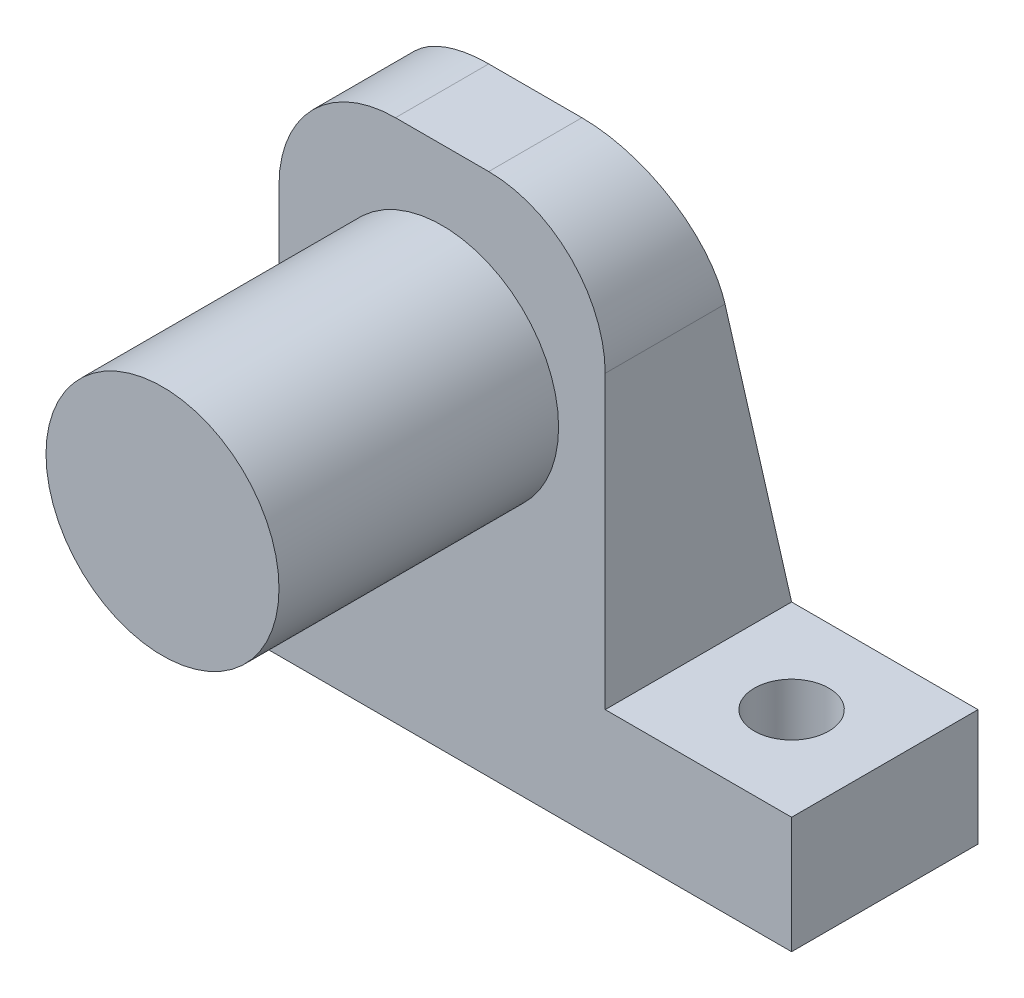
ISO-10303-21;
HEADER;
FILE_DESCRIPTION(('STEP AP214'),'2;1');
FILE_NAME('part.step','',(''),(''),'','','');
FILE_SCHEMA(('AUTOMOTIVE_DESIGN { 1 0 10303 214 1 1 1 1 }'));
ENDSEC;
DATA;
#1=APPLICATION_CONTEXT('core data for automotive mechanical design processes');
#2=APPLICATION_PROTOCOL_DEFINITION('international standard','automotive_design',2000,#1);
#3=PRODUCT_CONTEXT('',#1,'mechanical');
#4=PRODUCT('Part','Part','',(#3));
#5=PRODUCT_RELATED_PRODUCT_CATEGORY('part','',(#4));
#6=PRODUCT_DEFINITION_FORMATION('','',#4);
#7=PRODUCT_DEFINITION_CONTEXT('part definition',#1,'design');
#8=PRODUCT_DEFINITION('design','',#6,#7);
#9=PRODUCT_DEFINITION_SHAPE('','',#8);
#10=(LENGTH_UNIT() NAMED_UNIT(*) SI_UNIT(.MILLI.,.METRE.));
#11=(NAMED_UNIT(*) PLANE_ANGLE_UNIT() SI_UNIT($,.RADIAN.));
#12=(NAMED_UNIT(*) SI_UNIT($,.STERADIAN.) SOLID_ANGLE_UNIT());
#13=UNCERTAINTY_MEASURE_WITH_UNIT(LENGTH_MEASURE(1.E-05),#10,'distance_accuracy_value','');
#14=(GEOMETRIC_REPRESENTATION_CONTEXT(3) GLOBAL_UNCERTAINTY_ASSIGNED_CONTEXT((#13)) GLOBAL_UNIT_ASSIGNED_CONTEXT((#10,
#11,#12)) REPRESENTATION_CONTEXT('',''));
#15=CARTESIAN_POINT('',(0.,0.,0.));
#16=DIRECTION('',(0.,0.,1.));
#17=DIRECTION('',(1.,0.,0.));
#18=AXIS2_PLACEMENT_3D('',#15,#16,#17);
#19=CARTESIAN_POINT('',(7.,5.,8.));
#20=DIRECTION('',(-1.,0.,0.));
#21=DIRECTION('',(0.,0.,1.));
#22=AXIS2_PLACEMENT_3D('',#19,#20,#21);
#23=PLANE('',#22);
#24=DIRECTION('',(0.,-0.974858506571867,-0.222824801502141));
#25=VECTOR('',#24,1.);
#26=CARTESIAN_POINT('',(7.,6.7377812257564,0.397207137315748));
#27=LINE('',#26,#25);
#28=CARTESIAN_POINT('',(7.,17.5,2.85714285714285));
#29=VERTEX_POINT('',#28);
#30=CARTESIAN_POINT('',(7.,5.,0.));
#31=VERTEX_POINT('',#30);
#32=EDGE_CURVE('E48',#29,#31,#27,.T.);
#33=ORIENTED_EDGE('',*,*,#32,.F.);
#34=DIRECTION('',(0.,0.,-1.));
#35=VECTOR('',#34,1.);
#36=CARTESIAN_POINT('',(7.,17.5,8.));
#37=LINE('',#36,#35);
#38=CARTESIAN_POINT('',(7.,17.5,8.));
#39=VERTEX_POINT('',#38);
#40=EDGE_CURVE('E202',#39,#29,#37,.T.);
#41=ORIENTED_EDGE('',*,*,#40,.F.);
#42=DIRECTION('',(0.,1.,0.));
#43=VECTOR('',#42,1.);
#44=CARTESIAN_POINT('',(7.,5.,8.));
#45=LINE('',#44,#43);
#46=CARTESIAN_POINT('',(7.,5.,8.));
#47=VERTEX_POINT('',#46);
#48=EDGE_CURVE('E173',#47,#39,#45,.T.);
#49=ORIENTED_EDGE('',*,*,#48,.F.);
#50=DIRECTION('',(0.,0.,-1.));
#51=VECTOR('',#50,1.);
#52=CARTESIAN_POINT('',(7.,5.,8.));
#53=LINE('',#52,#51);
#54=EDGE_CURVE('E204',#47,#31,#53,.T.);
#55=ORIENTED_EDGE('',*,*,#54,.T.);
#56=EDGE_LOOP('',(#33,#41,#49,#55));
#57=FACE_BOUND('',#56,.T.);
#58=ADVANCED_FACE('F33',(#57),#23,.F.);
#59=CARTESIAN_POINT('',(2.,17.5,8.));
#60=DIRECTION('',(0.,0.,-1.));
#61=DIRECTION('',(-1.,0.,0.));
#62=AXIS2_PLACEMENT_3D('',#59,#60,#61);
#63=CYLINDRICAL_SURFACE('',#62,5.);
#64=CARTESIAN_POINT('',(2.,17.5,2.85714285714286));
#65=DIRECTION('',(0.,0.222824801502141,-0.974858506571867));
#66=DIRECTION('',(0.,-0.974858506571867,-0.222824801502141));
#67=AXIS2_PLACEMENT_3D('',#64,#65,#66);
#68=ELLIPSE('',#67,5.12894944886178,5.);
#69=CARTESIAN_POINT('',(1.99999999999996,22.5,4.));
#70=VERTEX_POINT('',#69);
#71=EDGE_CURVE('E55',#70,#29,#68,.T.);
#72=ORIENTED_EDGE('',*,*,#71,.F.);
#73=DIRECTION('',(0.,0.,-1.));
#74=VECTOR('',#73,1.);
#75=CARTESIAN_POINT('',(1.99999999999996,22.5,8.));
#76=LINE('',#75,#74);
#77=CARTESIAN_POINT('',(1.99999999999996,22.5,8.));
#78=VERTEX_POINT('',#77);
#79=EDGE_CURVE('E200',#78,#70,#76,.T.);
#80=ORIENTED_EDGE('',*,*,#79,.F.);
#81=CARTESIAN_POINT('',(2.,17.5,8.));
#82=DIRECTION('',(0.,0.,1.));
#83=DIRECTION('',(1.,0.,0.));
#84=AXIS2_PLACEMENT_3D('',#81,#82,#83);
#85=CIRCLE('',#84,5.);
#86=EDGE_CURVE('E175',#39,#78,#85,.T.);
#87=ORIENTED_EDGE('',*,*,#86,.F.);
#88=ORIENTED_EDGE('',*,*,#40,.T.);
#89=EDGE_LOOP('',(#72,#80,#87,#88));
#90=FACE_BOUND('',#89,.T.);
#91=ADVANCED_FACE('F234',(#90),#63,.T.);
#92=CARTESIAN_POINT('',(-1.99999999999996,22.5,8.));
#93=DIRECTION('',(0.,-1.,0.));
#94=DIRECTION('',(0.,0.,-1.));
#95=AXIS2_PLACEMENT_3D('',#92,#93,#94);
#96=PLANE('',#95);
#97=DIRECTION('',(1.,0.,0.));
#98=VECTOR('',#97,1.);
#99=CARTESIAN_POINT('',(-105.625,22.5,4.));
#100=LINE('',#99,#98);
#101=CARTESIAN_POINT('',(-1.99999999999996,22.5,4.));
#102=VERTEX_POINT('',#101);
#103=EDGE_CURVE('E143',#102,#70,#100,.T.);
#104=ORIENTED_EDGE('',*,*,#103,.F.);
#105=DIRECTION('',(0.,0.,-1.));
#106=VECTOR('',#105,1.);
#107=CARTESIAN_POINT('',(-1.99999999999996,22.5,8.));
#108=LINE('',#107,#106);
#109=CARTESIAN_POINT('',(-1.99999999999996,22.5,8.));
#110=VERTEX_POINT('',#109);
#111=EDGE_CURVE('E197',#110,#102,#108,.T.);
#112=ORIENTED_EDGE('',*,*,#111,.F.);
#113=DIRECTION('',(-1.,0.,0.));
#114=VECTOR('',#113,1.);
#115=CARTESIAN_POINT('',(-1.99999999999996,22.5,8.));
#116=LINE('',#115,#114);
#117=EDGE_CURVE('E177',#78,#110,#116,.T.);
#118=ORIENTED_EDGE('',*,*,#117,.F.);
#119=ORIENTED_EDGE('',*,*,#79,.T.);
#120=EDGE_LOOP('',(#104,#112,#118,#119));
#121=FACE_BOUND('',#120,.T.);
#122=ADVANCED_FACE('F239',(#121),#96,.F.);
#123=CARTESIAN_POINT('',(-2.,17.5,8.));
#124=DIRECTION('',(0.,0.,-1.));
#125=DIRECTION('',(-1.,0.,0.));
#126=AXIS2_PLACEMENT_3D('',#123,#124,#125);
#127=CYLINDRICAL_SURFACE('',#126,5.);
#128=CARTESIAN_POINT('',(-2.,17.5,2.85714285714286));
#129=DIRECTION('',(0.,0.222824801502141,-0.974858506571867));
#130=DIRECTION('',(0.,-0.974858506571867,-0.222824801502141));
#131=AXIS2_PLACEMENT_3D('',#128,#129,#130);
#132=ELLIPSE('',#131,5.12894944886178,5.);
#133=CARTESIAN_POINT('',(-7.,17.5,2.85714285714285));
#134=VERTEX_POINT('',#133);
#135=EDGE_CURVE('E142',#134,#102,#132,.T.);
#136=ORIENTED_EDGE('',*,*,#135,.F.);
#137=DIRECTION('',(0.,0.,-1.));
#138=VECTOR('',#137,1.);
#139=CARTESIAN_POINT('',(-7.,17.5,8.));
#140=LINE('',#139,#138);
#141=CARTESIAN_POINT('',(-7.,17.5,8.));
#142=VERTEX_POINT('',#141);
#143=EDGE_CURVE('E132',#142,#134,#140,.T.);
#144=ORIENTED_EDGE('',*,*,#143,.F.);
#145=CARTESIAN_POINT('',(-2.,17.5,8.));
#146=DIRECTION('',(0.,0.,1.));
#147=DIRECTION('',(1.,0.,0.));
#148=AXIS2_PLACEMENT_3D('',#145,#146,#147);
#149=CIRCLE('',#148,5.);
#150=EDGE_CURVE('E179',#110,#142,#149,.T.);
#151=ORIENTED_EDGE('',*,*,#150,.F.);
#152=ORIENTED_EDGE('',*,*,#111,.T.);
#153=EDGE_LOOP('',(#136,#144,#151,#152));
#154=FACE_BOUND('',#153,.T.);
#155=ADVANCED_FACE('F273',(#154),#127,.T.);
#156=CARTESIAN_POINT('',(-7.,5.,8.));
#157=DIRECTION('',(1.,0.,0.));
#158=DIRECTION('',(0.,0.,-1.));
#159=AXIS2_PLACEMENT_3D('',#156,#157,#158);
#160=PLANE('',#159);
#161=DIRECTION('',(0.,0.974858506571867,0.222824801502141));
#162=VECTOR('',#161,1.);
#163=CARTESIAN_POINT('',(-7.,6.7377812257564,0.397207137315748));
#164=LINE('',#163,#162);
#165=CARTESIAN_POINT('',(-6.99999999999999,5.,0.));
#166=VERTEX_POINT('',#165);
#167=EDGE_CURVE('E137',#166,#134,#164,.T.);
#168=ORIENTED_EDGE('',*,*,#167,.F.);
#169=DIRECTION('',(0.,0.,-1.));
#170=VECTOR('',#169,1.);
#171=CARTESIAN_POINT('',(-7.,5.,8.));
#172=LINE('',#171,#170);
#173=CARTESIAN_POINT('',(-7.,5.,8.));
#174=VERTEX_POINT('',#173);
#175=EDGE_CURVE('E126',#174,#166,#172,.T.);
#176=ORIENTED_EDGE('',*,*,#175,.F.);
#177=DIRECTION('',(0.,-1.,0.));
#178=VECTOR('',#177,1.);
#179=CARTESIAN_POINT('',(-7.,5.,8.));
#180=LINE('',#179,#178);
#181=EDGE_CURVE('E181',#142,#174,#180,.T.);
#182=ORIENTED_EDGE('',*,*,#181,.F.);
#183=ORIENTED_EDGE('',*,*,#143,.T.);
#184=EDGE_LOOP('',(#168,#176,#182,#183));
#185=FACE_BOUND('',#184,.T.);
#186=ADVANCED_FACE('F138',(#185),#160,.F.);
#187=CARTESIAN_POINT('',(2.,17.5,0.));
#188=DIRECTION('',(0.,0.,1.));
#189=DIRECTION('',(1.,0.,0.));
#190=AXIS2_PLACEMENT_3D('',#187,#188,#189);
#191=PLANE('',#190);
#192=DIRECTION('',(-1.,0.,0.));
#193=VECTOR('',#192,1.);
#194=CARTESIAN_POINT('',(2.,5.,0.));
#195=LINE('',#194,#193);
#196=EDGE_CURVE('E11',#31,#166,#195,.T.);
#197=ORIENTED_EDGE('',*,*,#196,.F.);
#198=DIRECTION('',(-1.,0.,0.));
#199=VECTOR('',#198,1.);
#200=CARTESIAN_POINT('',(15.,5.,0.));
#201=LINE('',#200,#199);
#202=CARTESIAN_POINT('',(15.,5.,0.));
#203=VERTEX_POINT('',#202);
#204=EDGE_CURVE('E122',#203,#31,#201,.T.);
#205=ORIENTED_EDGE('',*,*,#204,.F.);
#206=DIRECTION('',(0.,1.,0.));
#207=VECTOR('',#206,1.);
#208=CARTESIAN_POINT('',(15.,0.,0.));
#209=LINE('',#208,#207);
#210=CARTESIAN_POINT('',(15.,0.,0.));
#211=VERTEX_POINT('',#210);
#212=EDGE_CURVE('E188',#211,#203,#209,.T.);
#213=ORIENTED_EDGE('',*,*,#212,.F.);
#214=DIRECTION('',(1.,0.,0.));
#215=VECTOR('',#214,1.);
#216=CARTESIAN_POINT('',(0.,0.,0.));
#217=LINE('',#216,#215);
#218=CARTESIAN_POINT('',(-15.,0.,0.));
#219=VERTEX_POINT('',#218);
#220=EDGE_CURVE('E169',#219,#211,#217,.T.);
#221=ORIENTED_EDGE('',*,*,#220,.F.);
#222=DIRECTION('',(0.,-1.,0.));
#223=VECTOR('',#222,1.);
#224=CARTESIAN_POINT('',(-15.,0.,0.));
#225=LINE('',#224,#223);
#226=CARTESIAN_POINT('',(-15.,5.,0.));
#227=VERTEX_POINT('',#226);
#228=EDGE_CURVE('E118',#227,#219,#225,.T.);
#229=ORIENTED_EDGE('',*,*,#228,.F.);
#230=DIRECTION('',(-1.,0.,0.));
#231=VECTOR('',#230,1.);
#232=CARTESIAN_POINT('',(-15.,5.,0.));
#233=LINE('',#232,#231);
#234=EDGE_CURVE('E112',#166,#227,#233,.T.);
#235=ORIENTED_EDGE('',*,*,#234,.F.);
#236=EDGE_LOOP('',(#197,#205,#213,#221,#229,#235));
#237=FACE_BOUND('',#236,.T.);
#238=ADVANCED_FACE('F114',(#237),#191,.F.);
#239=CARTESIAN_POINT('',(2.,17.5,8.));
#240=DIRECTION('',(0.,0.,1.));
#241=DIRECTION('',(1.,0.,0.));
#242=AXIS2_PLACEMENT_3D('',#239,#240,#241);
#243=PLANE('',#242);
#244=DIRECTION('',(1.,0.,0.));
#245=VECTOR('',#244,1.);
#246=CARTESIAN_POINT('',(0.,0.,8.));
#247=LINE('',#246,#245);
#248=CARTESIAN_POINT('',(-15.,0.,8.));
#249=VERTEX_POINT('',#248);
#250=CARTESIAN_POINT('',(15.,0.,8.));
#251=VERTEX_POINT('',#250);
#252=EDGE_CURVE('E165',#249,#251,#247,.T.);
#253=ORIENTED_EDGE('',*,*,#252,.T.);
#254=DIRECTION('',(0.,1.,0.));
#255=VECTOR('',#254,1.);
#256=CARTESIAN_POINT('',(15.,0.,8.));
#257=LINE('',#256,#255);
#258=CARTESIAN_POINT('',(15.,5.,8.));
#259=VERTEX_POINT('',#258);
#260=EDGE_CURVE('E168',#251,#259,#257,.T.);
#261=ORIENTED_EDGE('',*,*,#260,.T.);
#262=DIRECTION('',(-1.,0.,0.));
#263=VECTOR('',#262,1.);
#264=CARTESIAN_POINT('',(15.,5.,8.));
#265=LINE('',#264,#263);
#266=EDGE_CURVE('E171',#259,#47,#265,.T.);
#267=ORIENTED_EDGE('',*,*,#266,.T.);
#268=ORIENTED_EDGE('',*,*,#48,.T.);
#269=ORIENTED_EDGE('',*,*,#86,.T.);
#270=ORIENTED_EDGE('',*,*,#117,.T.);
#271=ORIENTED_EDGE('',*,*,#150,.T.);
#272=ORIENTED_EDGE('',*,*,#181,.T.);
#273=DIRECTION('',(-1.,0.,0.));
#274=VECTOR('',#273,1.);
#275=CARTESIAN_POINT('',(-15.,5.,8.));
#276=LINE('',#275,#274);
#277=CARTESIAN_POINT('',(-15.,5.,8.));
#278=VERTEX_POINT('',#277);
#279=EDGE_CURVE('E129',#174,#278,#276,.T.);
#280=ORIENTED_EDGE('',*,*,#279,.T.);
#281=DIRECTION('',(0.,-1.,0.));
#282=VECTOR('',#281,1.);
#283=CARTESIAN_POINT('',(-15.,0.,8.));
#284=LINE('',#283,#282);
#285=EDGE_CURVE('E184',#278,#249,#284,.T.);
#286=ORIENTED_EDGE('',*,*,#285,.T.);
#287=EDGE_LOOP('',(#253,#261,#267,#268,#269,#270,#271,#272,#280,#286));
#288=FACE_BOUND('',#287,.T.);
#289=CARTESIAN_POINT('',(0.,14.5,8.));
#290=DIRECTION('',(0.,0.,1.));
#291=DIRECTION('',(1.,0.,0.));
#292=AXIS2_PLACEMENT_3D('',#289,#290,#291);
#293=CIRCLE('',#292,5.);
#294=CARTESIAN_POINT('',(5.,14.5,8.));
#295=VERTEX_POINT('',#294);
#296=EDGE_CURVE('E147',#295,#295,#293,.T.);
#297=ORIENTED_EDGE('',*,*,#296,.F.);
#298=EDGE_LOOP('',(#297));
#299=FACE_BOUND('',#298,.T.);
#300=ADVANCED_FACE('F252',(#288,#299),#243,.T.);
#301=CARTESIAN_POINT('',(15.,0.,8.));
#302=DIRECTION('',(-1.,0.,0.));
#303=DIRECTION('',(0.,0.,1.));
#304=AXIS2_PLACEMENT_3D('',#301,#302,#303);
#305=PLANE('',#304);
#306=ORIENTED_EDGE('',*,*,#212,.T.);
#307=DIRECTION('',(0.,0.,-1.));
#308=VECTOR('',#307,1.);
#309=CARTESIAN_POINT('',(15.,5.,8.));
#310=LINE('',#309,#308);
#311=EDGE_CURVE('E206',#259,#203,#310,.T.);
#312=ORIENTED_EDGE('',*,*,#311,.F.);
#313=ORIENTED_EDGE('',*,*,#260,.F.);
#314=DIRECTION('',(0.,0.,-1.));
#315=VECTOR('',#314,1.);
#316=CARTESIAN_POINT('',(15.,0.,8.));
#317=LINE('',#316,#315);
#318=EDGE_CURVE('E41',#251,#211,#317,.T.);
#319=ORIENTED_EDGE('',*,*,#318,.T.);
#320=EDGE_LOOP('',(#306,#312,#313,#319));
#321=FACE_BOUND('',#320,.T.);
#322=ADVANCED_FACE('F35',(#321),#305,.F.);
#323=CARTESIAN_POINT('',(15.,5.,8.));
#324=DIRECTION('',(0.,-1.,0.));
#325=DIRECTION('',(1.,0.,0.));
#326=AXIS2_PLACEMENT_3D('',#323,#324,#325);
#327=PLANE('',#326);
#328=CARTESIAN_POINT('',(11.,5.,4.));
#329=DIRECTION('',(0.,1.,0.));
#330=DIRECTION('',(0.,0.,-1.));
#331=AXIS2_PLACEMENT_3D('',#328,#329,#330);
#332=CIRCLE('',#331,1.6);
#333=CARTESIAN_POINT('',(11.,5.,2.4));
#334=VERTEX_POINT('',#333);
#335=EDGE_CURVE('E156',#334,#334,#332,.T.);
#336=ORIENTED_EDGE('',*,*,#335,.F.);
#337=EDGE_LOOP('',(#336));
#338=FACE_BOUND('',#337,.T.);
#339=ORIENTED_EDGE('',*,*,#204,.T.);
#340=ORIENTED_EDGE('',*,*,#54,.F.);
#341=ORIENTED_EDGE('',*,*,#266,.F.);
#342=ORIENTED_EDGE('',*,*,#311,.T.);
#343=EDGE_LOOP('',(#339,#340,#341,#342));
#344=FACE_BOUND('',#343,.T.);
#345=ADVANCED_FACE('F242',(#338,#344),#327,.F.);
#346=CARTESIAN_POINT('',(-15.,5.,8.));
#347=DIRECTION('',(0.,-1.,0.));
#348=DIRECTION('',(0.,0.,-1.));
#349=AXIS2_PLACEMENT_3D('',#346,#347,#348);
#350=PLANE('',#349);
#351=CARTESIAN_POINT('',(-11.,5.,4.));
#352=DIRECTION('',(0.,1.,0.));
#353=DIRECTION('',(0.,0.,1.));
#354=AXIS2_PLACEMENT_3D('',#351,#352,#353);
#355=CIRCLE('',#354,1.6);
#356=CARTESIAN_POINT('',(-11.,5.,5.6));
#357=VERTEX_POINT('',#356);
#358=EDGE_CURVE('E161',#357,#357,#355,.T.);
#359=ORIENTED_EDGE('',*,*,#358,.F.);
#360=EDGE_LOOP('',(#359));
#361=FACE_BOUND('',#360,.T.);
#362=ORIENTED_EDGE('',*,*,#234,.T.);
#363=DIRECTION('',(0.,0.,-1.));
#364=VECTOR('',#363,1.);
#365=CARTESIAN_POINT('',(-15.,5.,8.));
#366=LINE('',#365,#364);
#367=EDGE_CURVE('E133',#278,#227,#366,.T.);
#368=ORIENTED_EDGE('',*,*,#367,.F.);
#369=ORIENTED_EDGE('',*,*,#279,.F.);
#370=ORIENTED_EDGE('',*,*,#175,.T.);
#371=EDGE_LOOP('',(#362,#368,#369,#370));
#372=FACE_BOUND('',#371,.T.);
#373=ADVANCED_FACE('F128',(#361,#372),#350,.F.);
#374=CARTESIAN_POINT('',(-15.,0.,8.));
#375=DIRECTION('',(1.,0.,0.));
#376=DIRECTION('',(0.,0.,-1.));
#377=AXIS2_PLACEMENT_3D('',#374,#375,#376);
#378=PLANE('',#377);
#379=ORIENTED_EDGE('',*,*,#228,.T.);
#380=DIRECTION('',(0.,0.,-1.));
#381=VECTOR('',#380,1.);
#382=CARTESIAN_POINT('',(-15.,0.,8.));
#383=LINE('',#382,#381);
#384=EDGE_CURVE('E187',#249,#219,#383,.T.);
#385=ORIENTED_EDGE('',*,*,#384,.F.);
#386=ORIENTED_EDGE('',*,*,#285,.F.);
#387=ORIENTED_EDGE('',*,*,#367,.T.);
#388=EDGE_LOOP('',(#379,#385,#386,#387));
#389=FACE_BOUND('',#388,.T.);
#390=ADVANCED_FACE('F249',(#389),#378,.F.);
#391=CARTESIAN_POINT('',(0.,0.,8.));
#392=DIRECTION('',(0.,1.,0.));
#393=DIRECTION('',(-1.,0.,0.));
#394=AXIS2_PLACEMENT_3D('',#391,#392,#393);
#395=PLANE('',#394);
#396=CARTESIAN_POINT('',(11.,0.,4.));
#397=DIRECTION('',(0.,1.,0.));
#398=DIRECTION('',(-1.,0.,0.));
#399=AXIS2_PLACEMENT_3D('',#396,#397,#398);
#400=CIRCLE('',#399,1.6);
#401=CARTESIAN_POINT('',(9.4,0.,4.));
#402=VERTEX_POINT('',#401);
#403=EDGE_CURVE('E160',#402,#402,#400,.T.);
#404=ORIENTED_EDGE('',*,*,#403,.T.);
#405=EDGE_LOOP('',(#404));
#406=FACE_BOUND('',#405,.T.);
#407=CARTESIAN_POINT('',(-11.,0.,4.));
#408=DIRECTION('',(0.,1.,0.));
#409=DIRECTION('',(-1.,0.,0.));
#410=AXIS2_PLACEMENT_3D('',#407,#408,#409);
#411=CIRCLE('',#410,1.6);
#412=CARTESIAN_POINT('',(-12.6,0.,4.));
#413=VERTEX_POINT('',#412);
#414=EDGE_CURVE('E164',#413,#413,#411,.T.);
#415=ORIENTED_EDGE('',*,*,#414,.T.);
#416=EDGE_LOOP('',(#415));
#417=FACE_BOUND('',#416,.T.);
#418=ORIENTED_EDGE('',*,*,#220,.T.);
#419=ORIENTED_EDGE('',*,*,#318,.F.);
#420=ORIENTED_EDGE('',*,*,#252,.F.);
#421=ORIENTED_EDGE('',*,*,#384,.T.);
#422=EDGE_LOOP('',(#418,#419,#420,#421));
#423=FACE_BOUND('',#422,.T.);
#424=ADVANCED_FACE('F215',(#406,#417,#423),#395,.F.);
#425=CARTESIAN_POINT('',(-11.,-3.,4.));
#426=DIRECTION('',(0.,1.,0.));
#427=DIRECTION('',(0.,0.,1.));
#428=AXIS2_PLACEMENT_3D('',#425,#426,#427);
#429=CYLINDRICAL_SURFACE('',#428,1.6);
#430=ORIENTED_EDGE('',*,*,#358,.T.);
#431=EDGE_LOOP('',(#430));
#432=FACE_BOUND('',#431,.T.);
#433=ORIENTED_EDGE('',*,*,#414,.F.);
#434=EDGE_LOOP('',(#433));
#435=FACE_BOUND('',#434,.T.);
#436=ADVANCED_FACE('F221',(#432,#435),#429,.F.);
#437=CARTESIAN_POINT('',(11.,-3.,4.));
#438=DIRECTION('',(0.,1.,0.));
#439=DIRECTION('',(0.,0.,1.));
#440=AXIS2_PLACEMENT_3D('',#437,#438,#439);
#441=CYLINDRICAL_SURFACE('',#440,1.6);
#442=ORIENTED_EDGE('',*,*,#335,.T.);
#443=EDGE_LOOP('',(#442));
#444=FACE_BOUND('',#443,.T.);
#445=ORIENTED_EDGE('',*,*,#403,.F.);
#446=EDGE_LOOP('',(#445));
#447=FACE_BOUND('',#446,.T.);
#448=ADVANCED_FACE('F218',(#444,#447),#441,.F.);
#449=CARTESIAN_POINT('',(0.,14.5,20.));
#450=DIRECTION('',(0.,0.,-1.));
#451=DIRECTION('',(-1.,0.,0.));
#452=AXIS2_PLACEMENT_3D('',#449,#450,#451);
#453=CYLINDRICAL_SURFACE('',#452,5.);
#454=CARTESIAN_POINT('',(0.,14.5,20.));
#455=DIRECTION('',(0.,0.,1.));
#456=DIRECTION('',(1.,0.,0.));
#457=AXIS2_PLACEMENT_3D('',#454,#455,#456);
#458=CIRCLE('',#457,5.);
#459=CARTESIAN_POINT('',(5.,14.5,20.));
#460=VERTEX_POINT('',#459);
#461=EDGE_CURVE('E150',#460,#460,#458,.T.);
#462=ORIENTED_EDGE('',*,*,#461,.F.);
#463=EDGE_LOOP('',(#462));
#464=FACE_BOUND('',#463,.T.);
#465=ORIENTED_EDGE('',*,*,#296,.T.);
#466=EDGE_LOOP('',(#465));
#467=FACE_BOUND('',#466,.T.);
#468=ADVANCED_FACE('F220',(#464,#467),#453,.T.);
#469=CARTESIAN_POINT('',(0.,14.5,20.));
#470=DIRECTION('',(0.,0.,1.));
#471=DIRECTION('',(1.,0.,0.));
#472=AXIS2_PLACEMENT_3D('',#469,#470,#471);
#473=PLANE('',#472);
#474=ORIENTED_EDGE('',*,*,#461,.T.);
#475=EDGE_LOOP('',(#474));
#476=FACE_BOUND('',#475,.T.);
#477=ADVANCED_FACE('F228',(#476),#473,.T.);
#478=CARTESIAN_POINT('',(-105.625,5.,0.));
#479=DIRECTION('',(0.,0.222824801502141,-0.974858506571867));
#480=DIRECTION('',(0.,0.974858506571867,0.222824801502141));
#481=AXIS2_PLACEMENT_3D('',#478,#479,#480);
#482=PLANE('',#481);
#483=ORIENTED_EDGE('',*,*,#71,.T.);
#484=ORIENTED_EDGE('',*,*,#32,.T.);
#485=ORIENTED_EDGE('',*,*,#196,.T.);
#486=ORIENTED_EDGE('',*,*,#167,.T.);
#487=ORIENTED_EDGE('',*,*,#135,.T.);
#488=ORIENTED_EDGE('',*,*,#103,.T.);
#489=EDGE_LOOP('',(#483,#484,#485,#486,#487,#488));
#490=FACE_BOUND('',#489,.T.);
#491=ADVANCED_FACE('F145',(#490),#482,.T.);
#492=CLOSED_SHELL('',(#58,#91,#122,#155,#186,#238,#300,#322,#345,#373,#390,#424,#436,#448,#468,
#477,#491));
#493=MANIFOLD_SOLID_BREP('B2',#492);
#494=ADVANCED_BREP_SHAPE_REPRESENTATION('',(#18,#493),#14);
#495=SHAPE_DEFINITION_REPRESENTATION(#9,#494);
ENDSEC;
END-ISO-10303-21;
